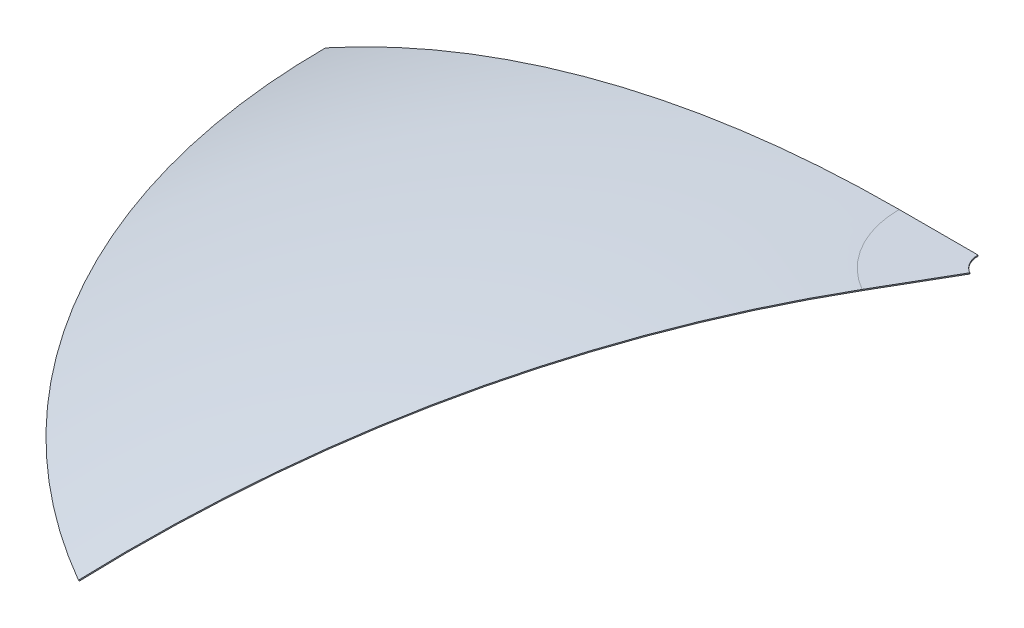
ISO-10303-21;
HEADER;
FILE_DESCRIPTION(('STEP AP214'),'2;1');
FILE_NAME('part.step','',(''),(''),'','','');
FILE_SCHEMA(('AUTOMOTIVE_DESIGN { 1 0 10303 214 1 1 1 1 }'));
ENDSEC;
DATA;
#1=APPLICATION_CONTEXT('core data for automotive mechanical design processes');
#2=APPLICATION_PROTOCOL_DEFINITION('international standard','automotive_design',2000,#1);
#3=PRODUCT_CONTEXT('',#1,'mechanical');
#4=PRODUCT('Part','Part','',(#3));
#5=PRODUCT_RELATED_PRODUCT_CATEGORY('part','',(#4));
#6=PRODUCT_DEFINITION_FORMATION('','',#4);
#7=PRODUCT_DEFINITION_CONTEXT('part definition',#1,'design');
#8=PRODUCT_DEFINITION('design','',#6,#7);
#9=PRODUCT_DEFINITION_SHAPE('','',#8);
#10=(LENGTH_UNIT() NAMED_UNIT(*) SI_UNIT(.MILLI.,.METRE.));
#11=(NAMED_UNIT(*) PLANE_ANGLE_UNIT() SI_UNIT($,.RADIAN.));
#12=(NAMED_UNIT(*) SI_UNIT($,.STERADIAN.) SOLID_ANGLE_UNIT());
#13=UNCERTAINTY_MEASURE_WITH_UNIT(LENGTH_MEASURE(1.E-05),#10,'distance_accuracy_value','');
#14=(GEOMETRIC_REPRESENTATION_CONTEXT(3) GLOBAL_UNCERTAINTY_ASSIGNED_CONTEXT((#13)) GLOBAL_UNIT_ASSIGNED_CONTEXT((#10,
#11,#12)) REPRESENTATION_CONTEXT('',''));
#15=CARTESIAN_POINT('',(0.,0.,0.));
#16=DIRECTION('',(0.,0.,1.));
#17=DIRECTION('',(1.,0.,0.));
#18=AXIS2_PLACEMENT_3D('',#15,#16,#17);
#19=CARTESIAN_POINT('',(-22.4999999999999,1.50000000000002,38.9711431702998));
#20=DIRECTION('',(0.,1.,0.));
#21=DIRECTION('',(-1.,0.,0.));
#22=AXIS2_PLACEMENT_3D('',#19,#20,#21);
#23=PLANE('',#22);
#24=CARTESIAN_POINT('',(0.,1.49999999999995,0.));
#25=DIRECTION('',(0.,-1.,0.));
#26=DIRECTION('',(1.,0.,0.));
#27=AXIS2_PLACEMENT_3D('',#24,#25,#26);
#28=CIRCLE('',#27,10.);
#29=CARTESIAN_POINT('',(-4.99999999999998,1.50000000000002,8.6602540378444));
#30=VERTEX_POINT('',#29);
#31=CARTESIAN_POINT('',(-10.,1.5,0.));
#32=VERTEX_POINT('',#31);
#33=EDGE_CURVE('E55',#30,#32,#28,.T.);
#34=ORIENTED_EDGE('',*,*,#33,.F.);
#35=DIRECTION('',(0.499999999999998,0.,-0.86602540378444));
#36=VECTOR('',#35,1.);
#37=CARTESIAN_POINT('',(-22.4999999999999,1.50000000000008,38.9711431702998));
#38=LINE('',#37,#36);
#39=CARTESIAN_POINT('',(-22.4999999999999,1.50000000000008,38.9711431702998));
#40=VERTEX_POINT('',#39);
#41=EDGE_CURVE('E122',#40,#30,#38,.T.);
#42=ORIENTED_EDGE('',*,*,#41,.F.);
#43=CARTESIAN_POINT('',(0.,1.50000000000017,0.));
#44=DIRECTION('',(0.,-1.,0.));
#45=DIRECTION('',(1.,0.,0.));
#46=AXIS2_PLACEMENT_3D('',#43,#44,#45);
#47=CIRCLE('',#46,45.);
#48=CARTESIAN_POINT('',(-45.,1.5,0.));
#49=VERTEX_POINT('',#48);
#50=EDGE_CURVE('E11',#40,#49,#47,.T.);
#51=ORIENTED_EDGE('',*,*,#50,.T.);
#52=DIRECTION('',(1.,0.,0.));
#53=VECTOR('',#52,1.);
#54=CARTESIAN_POINT('',(-45.,1.5,0.));
#55=LINE('',#54,#53);
#56=EDGE_CURVE('E119',#49,#32,#55,.T.);
#57=ORIENTED_EDGE('',*,*,#56,.T.);
#58=EDGE_LOOP('',(#34,#42,#51,#57));
#59=FACE_BOUND('',#58,.T.);
#60=ADVANCED_FACE('F47',(#59),#23,.F.);
#61=CARTESIAN_POINT('',(3.43024899888577E-12,-998.5,0.));
#62=DIRECTION('',(0.,-1.,0.));
#63=DIRECTION('',(1.,0.,0.));
#64=AXIS2_PLACEMENT_3D('',#61,#62,#63);
#65=CYLINDRICAL_SURFACE('',#64,10.);
#66=CARTESIAN_POINT('',(0.,2.00000000000011,0.));
#67=DIRECTION('',(0.,-1.,0.));
#68=DIRECTION('',(1.,0.,0.));
#69=AXIS2_PLACEMENT_3D('',#66,#67,#68);
#70=CIRCLE('',#69,10.);
#71=CARTESIAN_POINT('',(-4.99999999999998,2.00000000000002,8.6602540378444));
#72=VERTEX_POINT('',#71);
#73=CARTESIAN_POINT('',(-10.,2.,0.));
#74=VERTEX_POINT('',#73);
#75=EDGE_CURVE('E166',#72,#74,#70,.T.);
#76=ORIENTED_EDGE('',*,*,#75,.F.);
#77=DIRECTION('',(0.,1.,0.));
#78=VECTOR('',#77,1.);
#79=CARTESIAN_POINT('',(-4.99999999999998,2.00000000000002,8.6602540378444));
#80=LINE('',#79,#78);
#81=EDGE_CURVE('E145',#30,#72,#80,.T.);
#82=ORIENTED_EDGE('',*,*,#81,.F.);
#83=ORIENTED_EDGE('',*,*,#33,.T.);
#84=DIRECTION('',(0.,1.,0.));
#85=VECTOR('',#84,1.);
#86=CARTESIAN_POINT('',(-10.,2.,0.));
#87=LINE('',#86,#85);
#88=EDGE_CURVE('E126',#32,#74,#87,.T.);
#89=ORIENTED_EDGE('',*,*,#88,.T.);
#90=EDGE_LOOP('',(#76,#82,#83,#89));
#91=FACE_BOUND('',#90,.T.);
#92=ADVANCED_FACE('F171',(#91),#65,.F.);
#93=CARTESIAN_POINT('',(-22.4999999999999,2.00000000000002,38.9711431702998));
#94=DIRECTION('',(0.,-1.,0.));
#95=DIRECTION('',(1.,0.,0.));
#96=AXIS2_PLACEMENT_3D('',#93,#94,#95);
#97=PLANE('',#96);
#98=CARTESIAN_POINT('',(0.,2.00000000000011,0.));
#99=DIRECTION('',(0.,-1.,0.));
#100=DIRECTION('',(1.,0.,0.));
#101=AXIS2_PLACEMENT_3D('',#98,#99,#100);
#102=CIRCLE('',#101,45.);
#103=CARTESIAN_POINT('',(-22.4999999999999,2.00000000000008,38.9711431702998));
#104=VERTEX_POINT('',#103);
#105=CARTESIAN_POINT('',(-45.,2.,0.));
#106=VERTEX_POINT('',#105);
#107=EDGE_CURVE('E163',#104,#106,#102,.T.);
#108=ORIENTED_EDGE('',*,*,#107,.F.);
#109=DIRECTION('',(-0.499999999999998,0.,0.86602540378444));
#110=VECTOR('',#109,1.);
#111=CARTESIAN_POINT('',(-22.4999999999999,2.00000000000008,38.9711431702998));
#112=LINE('',#111,#110);
#113=EDGE_CURVE('E149',#72,#104,#112,.T.);
#114=ORIENTED_EDGE('',*,*,#113,.F.);
#115=ORIENTED_EDGE('',*,*,#75,.T.);
#116=DIRECTION('',(-1.,0.,0.));
#117=VECTOR('',#116,1.);
#118=CARTESIAN_POINT('',(-45.,2.,0.));
#119=LINE('',#118,#117);
#120=EDGE_CURVE('E130',#74,#106,#119,.T.);
#121=ORIENTED_EDGE('',*,*,#120,.T.);
#122=EDGE_LOOP('',(#108,#114,#115,#121));
#123=FACE_BOUND('',#122,.T.);
#124=ADVANCED_FACE('F181',(#123),#97,.F.);
#125=CARTESIAN_POINT('',(1.81799020282369E-12,-528.163893918988,0.));
#126=DIRECTION('',(0.,-1.,0.));
#127=DIRECTION('',(1.,0.,0.));
#128=AXIS2_PLACEMENT_3D('',#125,#126,#127);
#129=DEGENERATE_TOROIDAL_SURFACE('',#128,45.0000000000018,530.163893918988,.T.);
#130=CARTESIAN_POINT('',(2.21974962611907E-13,-63.2110348793953,0.));
#131=DIRECTION('',(0.,-1.,0.));
#132=DIRECTION('',(1.,0.,0.));
#133=AXIS2_PLACEMENT_3D('',#130,#131,#132);
#134=CIRCLE('',#133,299.740246695048);
#135=CARTESIAN_POINT('',(-149.870123347523,-63.2110348793959,259.582668174526));
#136=VERTEX_POINT('',#135);
#137=CARTESIAN_POINT('',(-299.740246695048,-63.2110348793964,0.));
#138=VERTEX_POINT('',#137);
#139=EDGE_CURVE('E159',#136,#138,#134,.T.);
#140=ORIENTED_EDGE('',*,*,#139,.F.);
#141=CARTESIAN_POINT('',(-22.499999999999,-528.163893918988,38.9711431703014));
#142=DIRECTION('',(0.86602540378444,0.,0.499999999999998));
#143=DIRECTION('',(0.499999999999998,0.,-0.86602540378444));
#144=AXIS2_PLACEMENT_3D('',#141,#142,#143);
#145=CIRCLE('',#144,530.163893918988);
#146=EDGE_CURVE('E70',#104,#136,#145,.T.);
#147=ORIENTED_EDGE('',*,*,#146,.F.);
#148=ORIENTED_EDGE('',*,*,#107,.T.);
#149=CARTESIAN_POINT('',(-45.,-528.163893918988,0.));
#150=DIRECTION('',(0.,0.,1.));
#151=DIRECTION('',(1.,0.,0.));
#152=AXIS2_PLACEMENT_3D('',#149,#150,#151);
#153=CIRCLE('',#152,530.163893918988);
#154=EDGE_CURVE('E136',#106,#138,#153,.T.);
#155=ORIENTED_EDGE('',*,*,#154,.T.);
#156=EDGE_LOOP('',(#140,#147,#148,#155));
#157=FACE_BOUND('',#156,.T.);
#158=ADVANCED_FACE('F179',(#157),#129,.T.);
#159=CARTESIAN_POINT('',(2.21974962611907E-13,-63.2110348793953,0.));
#160=DIRECTION('',(0.,1.,0.));
#161=DIRECTION('',(-1.,0.,0.));
#162=AXIS2_PLACEMENT_3D('',#159,#160,#161);
#163=CONICAL_SURFACE('',#162,299.740246695048,0.501217215293902);
#164=CARTESIAN_POINT('',(2.23479123964221E-13,-63.6495340533042,0.));
#165=DIRECTION('',(0.,-1.,0.));
#166=DIRECTION('',(1.,0.,0.));
#167=AXIS2_PLACEMENT_3D('',#164,#165,#166);
#168=CIRCLE('',#167,299.5);
#169=CARTESIAN_POINT('',(-149.749999999999,-63.6495340533047,259.37460843344));
#170=VERTEX_POINT('',#169);
#171=CARTESIAN_POINT('',(-299.5,-63.6495340533053,0.));
#172=VERTEX_POINT('',#171);
#173=EDGE_CURVE('E108',#170,#172,#168,.T.);
#174=ORIENTED_EDGE('',*,*,#173,.F.);
#175=DIRECTION('',(0.240246695047427,-0.876998347817804,-0.416119482172646));
#176=VECTOR('',#175,1.);
#177=CARTESIAN_POINT('',(-149.870123347523,-63.2110348793959,259.582668174526));
#178=LINE('',#177,#176);
#179=EDGE_CURVE('E154',#136,#170,#178,.T.);
#180=ORIENTED_EDGE('',*,*,#179,.F.);
#181=ORIENTED_EDGE('',*,*,#139,.T.);
#182=DIRECTION('',(0.480493390094852,-0.876998347817803,0.));
#183=VECTOR('',#182,1.);
#184=CARTESIAN_POINT('',(-299.740246695048,-63.2110348793964,0.));
#185=LINE('',#184,#183);
#186=EDGE_CURVE('E114',#138,#172,#185,.T.);
#187=ORIENTED_EDGE('',*,*,#186,.T.);
#188=EDGE_LOOP('',(#174,#180,#181,#187));
#189=FACE_BOUND('',#188,.T.);
#190=ADVANCED_FACE('F176',(#189),#163,.T.);
#191=CARTESIAN_POINT('',(1.81799020282369E-12,-528.163893918988,0.));
#192=DIRECTION('',(0.,-1.,0.));
#193=DIRECTION('',(1.,0.,0.));
#194=AXIS2_PLACEMENT_3D('',#191,#192,#193);
#195=DEGENERATE_TOROIDAL_SURFACE('',#194,45.0000000000018,529.663893918988,.T.);
#196=CARTESIAN_POINT('',(-22.499999999999,-528.163893918988,38.9711431703014));
#197=DIRECTION('',(-0.86602540378444,0.,-0.499999999999998));
#198=DIRECTION('',(0.499999999999998,0.,-0.86602540378444));
#199=AXIS2_PLACEMENT_3D('',#196,#197,#198);
#200=CIRCLE('',#199,529.663893918988);
#201=EDGE_CURVE('E62',#170,#40,#200,.T.);
#202=ORIENTED_EDGE('',*,*,#201,.F.);
#203=ORIENTED_EDGE('',*,*,#173,.T.);
#204=CARTESIAN_POINT('',(-45.,-528.163893918988,0.));
#205=DIRECTION('',(0.,0.,-1.));
#206=DIRECTION('',(1.,0.,0.));
#207=AXIS2_PLACEMENT_3D('',#204,#205,#206);
#208=CIRCLE('',#207,529.663893918988);
#209=EDGE_CURVE('E106',#172,#49,#208,.T.);
#210=ORIENTED_EDGE('',*,*,#209,.T.);
#211=ORIENTED_EDGE('',*,*,#50,.F.);
#212=EDGE_LOOP('',(#202,#203,#210,#211));
#213=FACE_BOUND('',#212,.T.);
#214=ADVANCED_FACE('F107',(#213),#195,.F.);
#215=CARTESIAN_POINT('',(-22.499999999999,-528.163893918988,38.9711431703014));
#216=DIRECTION('',(0.86602540378444,0.,0.499999999999998));
#217=DIRECTION('',(0.499999999999998,0.,-0.86602540378444));
#218=AXIS2_PLACEMENT_3D('',#215,#216,#217);
#219=PLANE('',#218);
#220=ORIENTED_EDGE('',*,*,#201,.T.);
#221=ORIENTED_EDGE('',*,*,#41,.T.);
#222=ORIENTED_EDGE('',*,*,#81,.T.);
#223=ORIENTED_EDGE('',*,*,#113,.T.);
#224=ORIENTED_EDGE('',*,*,#146,.T.);
#225=ORIENTED_EDGE('',*,*,#179,.T.);
#226=EDGE_LOOP('',(#220,#221,#222,#223,#224,#225));
#227=FACE_BOUND('',#226,.T.);
#228=ADVANCED_FACE('F172',(#227),#219,.T.);
#229=CARTESIAN_POINT('',(-45.,-528.163893918988,0.));
#230=DIRECTION('',(0.,0.,1.));
#231=DIRECTION('',(1.,0.,0.));
#232=AXIS2_PLACEMENT_3D('',#229,#230,#231);
#233=PLANE('',#232);
#234=ORIENTED_EDGE('',*,*,#56,.F.);
#235=ORIENTED_EDGE('',*,*,#209,.F.);
#236=ORIENTED_EDGE('',*,*,#186,.F.);
#237=ORIENTED_EDGE('',*,*,#154,.F.);
#238=ORIENTED_EDGE('',*,*,#120,.F.);
#239=ORIENTED_EDGE('',*,*,#88,.F.);
#240=EDGE_LOOP('',(#234,#235,#236,#237,#238,#239));
#241=FACE_BOUND('',#240,.T.);
#242=ADVANCED_FACE('F123',(#241),#233,.F.);
#243=CLOSED_SHELL('',(#60,#92,#124,#158,#190,#214,#228,#242));
#244=MANIFOLD_SOLID_BREP('B2',#243);
#245=ADVANCED_BREP_SHAPE_REPRESENTATION('',(#18,#244),#14);
#246=SHAPE_DEFINITION_REPRESENTATION(#9,#245);
ENDSEC;
END-ISO-10303-21;
